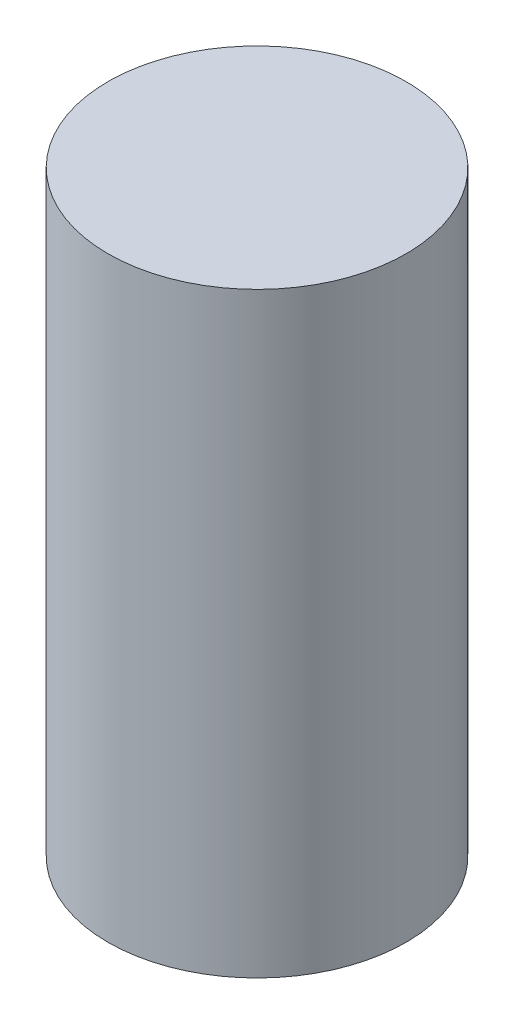
ISO-10303-21;
HEADER;
FILE_DESCRIPTION(('STEP AP214'),'2;1');
FILE_NAME('part.step','',(''),(''),'','','');
FILE_SCHEMA(('AUTOMOTIVE_DESIGN { 1 0 10303 214 1 1 1 1 }'));
ENDSEC;
DATA;
#1=APPLICATION_CONTEXT('core data for automotive mechanical design processes');
#2=APPLICATION_PROTOCOL_DEFINITION('international standard','automotive_design',2000,#1);
#3=PRODUCT_CONTEXT('',#1,'mechanical');
#4=PRODUCT('Part','Part','',(#3));
#5=PRODUCT_RELATED_PRODUCT_CATEGORY('part','',(#4));
#6=PRODUCT_DEFINITION_FORMATION('','',#4);
#7=PRODUCT_DEFINITION_CONTEXT('part definition',#1,'design');
#8=PRODUCT_DEFINITION('design','',#6,#7);
#9=PRODUCT_DEFINITION_SHAPE('','',#8);
#10=(LENGTH_UNIT() NAMED_UNIT(*) SI_UNIT(.MILLI.,.METRE.));
#11=(NAMED_UNIT(*) PLANE_ANGLE_UNIT() SI_UNIT($,.RADIAN.));
#12=(NAMED_UNIT(*) SI_UNIT($,.STERADIAN.) SOLID_ANGLE_UNIT());
#13=UNCERTAINTY_MEASURE_WITH_UNIT(LENGTH_MEASURE(1.E-05),#10,'distance_accuracy_value','');
#14=(GEOMETRIC_REPRESENTATION_CONTEXT(3) GLOBAL_UNCERTAINTY_ASSIGNED_CONTEXT((#13)) GLOBAL_UNIT_ASSIGNED_CONTEXT((#10,
#11,#12)) REPRESENTATION_CONTEXT('',''));
#15=CARTESIAN_POINT('',(0.,0.,0.));
#16=DIRECTION('',(0.,0.,1.));
#17=DIRECTION('',(1.,0.,0.));
#18=AXIS2_PLACEMENT_3D('',#15,#16,#17);
#19=CARTESIAN_POINT('',(0.,2.,0.));
#20=DIRECTION('',(0.,-1.,0.));
#21=DIRECTION('',(0.,0.,-1.));
#22=AXIS2_PLACEMENT_3D('',#19,#20,#21);
#23=CYLINDRICAL_SURFACE('',#22,0.5);
#24=CARTESIAN_POINT('',(0.,2.,0.));
#25=DIRECTION('',(0.,1.,0.));
#26=DIRECTION('',(0.,0.,1.));
#27=AXIS2_PLACEMENT_3D('',#24,#25,#26);
#28=CIRCLE('',#27,0.5);
#29=CARTESIAN_POINT('',(0.,2.,0.5));
#30=VERTEX_POINT('',#29);
#31=EDGE_CURVE('E10',#30,#30,#28,.T.);
#32=ORIENTED_EDGE('',*,*,#31,.F.);
#33=EDGE_LOOP('',(#32));
#34=FACE_BOUND('',#33,.T.);
#35=CARTESIAN_POINT('',(0.,0.,0.));
#36=DIRECTION('',(0.,1.,0.));
#37=DIRECTION('',(0.,0.,1.));
#38=AXIS2_PLACEMENT_3D('',#35,#36,#37);
#39=CIRCLE('',#38,0.5);
#40=CARTESIAN_POINT('',(0.,0.,0.5));
#41=VERTEX_POINT('',#40);
#42=EDGE_CURVE('E33',#41,#41,#39,.T.);
#43=ORIENTED_EDGE('',*,*,#42,.T.);
#44=EDGE_LOOP('',(#43));
#45=FACE_BOUND('',#44,.T.);
#46=ADVANCED_FACE('F30',(#34,#45),#23,.T.);
#47=CARTESIAN_POINT('',(0.,2.,0.));
#48=DIRECTION('',(0.,1.,0.));
#49=DIRECTION('',(0.,0.,1.));
#50=AXIS2_PLACEMENT_3D('',#47,#48,#49);
#51=PLANE('',#50);
#52=ORIENTED_EDGE('',*,*,#31,.T.);
#53=EDGE_LOOP('',(#52));
#54=FACE_BOUND('',#53,.T.);
#55=ADVANCED_FACE('F45',(#54),#51,.T.);
#56=CARTESIAN_POINT('',(0.,0.,0.));
#57=DIRECTION('',(0.,1.,0.));
#58=DIRECTION('',(0.,0.,1.));
#59=AXIS2_PLACEMENT_3D('',#56,#57,#58);
#60=PLANE('',#59);
#61=ORIENTED_EDGE('',*,*,#42,.F.);
#62=EDGE_LOOP('',(#61));
#63=FACE_BOUND('',#62,.T.);
#64=ADVANCED_FACE('F43',(#63),#60,.F.);
#65=CLOSED_SHELL('',(#46,#55,#64));
#66=MANIFOLD_SOLID_BREP('B2',#65);
#67=ADVANCED_BREP_SHAPE_REPRESENTATION('',(#18,#66),#14);
#68=SHAPE_DEFINITION_REPRESENTATION(#9,#67);
ENDSEC;
END-ISO-10303-21;
